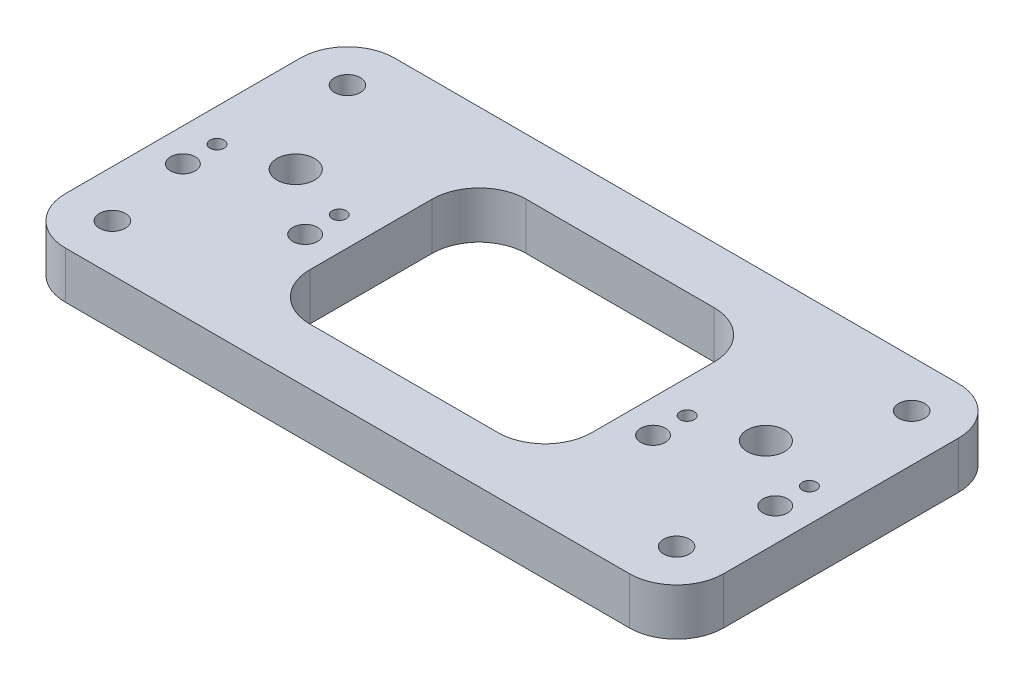
ISO-10303-21;
HEADER;
FILE_DESCRIPTION(('STEP AP214'),'2;1');
FILE_NAME('part.step','',(''),(''),'','','');
FILE_SCHEMA(('AUTOMOTIVE_DESIGN { 1 0 10303 214 1 1 1 1 }'));
ENDSEC;
DATA;
#1=APPLICATION_CONTEXT('core data for automotive mechanical design processes');
#2=APPLICATION_PROTOCOL_DEFINITION('international standard','automotive_design',2000,#1);
#3=PRODUCT_CONTEXT('',#1,'mechanical');
#4=PRODUCT('Part','Part','',(#3));
#5=PRODUCT_RELATED_PRODUCT_CATEGORY('part','',(#4));
#6=PRODUCT_DEFINITION_FORMATION('','',#4);
#7=PRODUCT_DEFINITION_CONTEXT('part definition',#1,'design');
#8=PRODUCT_DEFINITION('design','',#6,#7);
#9=PRODUCT_DEFINITION_SHAPE('','',#8);
#10=(LENGTH_UNIT() NAMED_UNIT(*) SI_UNIT(.MILLI.,.METRE.));
#11=(NAMED_UNIT(*) PLANE_ANGLE_UNIT() SI_UNIT($,.RADIAN.));
#12=(NAMED_UNIT(*) SI_UNIT($,.STERADIAN.) SOLID_ANGLE_UNIT());
#13=UNCERTAINTY_MEASURE_WITH_UNIT(LENGTH_MEASURE(1.E-05),#10,'distance_accuracy_value','');
#14=(GEOMETRIC_REPRESENTATION_CONTEXT(3) GLOBAL_UNCERTAINTY_ASSIGNED_CONTEXT((#13)) GLOBAL_UNIT_ASSIGNED_CONTEXT((#10,
#11,#12)) REPRESENTATION_CONTEXT('',''));
#15=CARTESIAN_POINT('',(0.,0.,0.));
#16=DIRECTION('',(0.,0.,1.));
#17=DIRECTION('',(1.,0.,0.));
#18=AXIS2_PLACEMENT_3D('',#15,#16,#17);
#19=CARTESIAN_POINT('',(70.,10.,-35.));
#20=DIRECTION('',(-1.,0.,0.));
#21=DIRECTION('',(0.,0.,1.));
#22=AXIS2_PLACEMENT_3D('',#19,#20,#21);
#23=PLANE('',#22);
#24=DIRECTION('',(0.,0.,-1.));
#25=VECTOR('',#24,1.);
#26=CARTESIAN_POINT('',(70.,10.,-35.));
#27=LINE('',#26,#25);
#28=CARTESIAN_POINT('',(70.,10.,25.));
#29=VERTEX_POINT('',#28);
#30=CARTESIAN_POINT('',(70.,10.,-25.));
#31=VERTEX_POINT('',#30);
#32=EDGE_CURVE('E168',#29,#31,#27,.T.);
#33=ORIENTED_EDGE('',*,*,#32,.F.);
#34=DIRECTION('',(0.,-1.,0.));
#35=VECTOR('',#34,1.);
#36=CARTESIAN_POINT('',(70.,10.,25.));
#37=LINE('',#36,#35);
#38=CARTESIAN_POINT('',(70.,0.,25.));
#39=VERTEX_POINT('',#38);
#40=EDGE_CURVE('E153',#29,#39,#37,.T.);
#41=ORIENTED_EDGE('',*,*,#40,.T.);
#42=DIRECTION('',(0.,0.,-1.));
#43=VECTOR('',#42,1.);
#44=CARTESIAN_POINT('',(70.,0.,-35.));
#45=LINE('',#44,#43);
#46=CARTESIAN_POINT('',(70.,0.,-25.));
#47=VERTEX_POINT('',#46);
#48=EDGE_CURVE('E165',#39,#47,#45,.T.);
#49=ORIENTED_EDGE('',*,*,#48,.T.);
#50=DIRECTION('',(0.,-1.,0.));
#51=VECTOR('',#50,1.);
#52=CARTESIAN_POINT('',(70.,10.,-25.));
#53=LINE('',#52,#51);
#54=EDGE_CURVE('E170',#47,#31,#53,.F.);
#55=ORIENTED_EDGE('',*,*,#54,.T.);
#56=EDGE_LOOP('',(#33,#41,#49,#55));
#57=FACE_BOUND('',#56,.T.);
#58=ADVANCED_FACE('F35',(#57),#23,.F.);
#59=CARTESIAN_POINT('',(-70.,10.,-35.));
#60=DIRECTION('',(0.,0.,1.));
#61=DIRECTION('',(1.,0.,0.));
#62=AXIS2_PLACEMENT_3D('',#59,#60,#61);
#63=PLANE('',#62);
#64=DIRECTION('',(-1.,0.,0.));
#65=VECTOR('',#64,1.);
#66=CARTESIAN_POINT('',(-70.,10.,-35.));
#67=LINE('',#66,#65);
#68=CARTESIAN_POINT('',(60.,10.,-35.));
#69=VERTEX_POINT('',#68);
#70=CARTESIAN_POINT('',(-60.,10.,-35.));
#71=VERTEX_POINT('',#70);
#72=EDGE_CURVE('E365',#69,#71,#67,.T.);
#73=ORIENTED_EDGE('',*,*,#72,.F.);
#74=DIRECTION('',(0.,-1.,0.));
#75=VECTOR('',#74,1.);
#76=CARTESIAN_POINT('',(60.,10.,-35.));
#77=LINE('',#76,#75);
#78=CARTESIAN_POINT('',(60.,0.,-35.));
#79=VERTEX_POINT('',#78);
#80=EDGE_CURVE('E209',#69,#79,#77,.T.);
#81=ORIENTED_EDGE('',*,*,#80,.T.);
#82=DIRECTION('',(-1.,0.,0.));
#83=VECTOR('',#82,1.);
#84=CARTESIAN_POINT('',(-70.,0.,-35.));
#85=LINE('',#84,#83);
#86=CARTESIAN_POINT('',(-60.,0.,-35.));
#87=VERTEX_POINT('',#86);
#88=EDGE_CURVE('E174',#79,#87,#85,.T.);
#89=ORIENTED_EDGE('',*,*,#88,.T.);
#90=DIRECTION('',(0.,-1.,0.));
#91=VECTOR('',#90,1.);
#92=CARTESIAN_POINT('',(-60.,10.,-35.));
#93=LINE('',#92,#91);
#94=EDGE_CURVE('E207',#87,#71,#93,.F.);
#95=ORIENTED_EDGE('',*,*,#94,.T.);
#96=EDGE_LOOP('',(#73,#81,#89,#95));
#97=FACE_BOUND('',#96,.T.);
#98=ADVANCED_FACE('F390',(#97),#63,.F.);
#99=CARTESIAN_POINT('',(-70.,10.,-35.));
#100=DIRECTION('',(1.,0.,0.));
#101=DIRECTION('',(0.,0.,-1.));
#102=AXIS2_PLACEMENT_3D('',#99,#100,#101);
#103=PLANE('',#102);
#104=DIRECTION('',(0.,0.,1.));
#105=VECTOR('',#104,1.);
#106=CARTESIAN_POINT('',(-70.,10.,-35.));
#107=LINE('',#106,#105);
#108=CARTESIAN_POINT('',(-70.,10.,-25.));
#109=VERTEX_POINT('',#108);
#110=CARTESIAN_POINT('',(-70.,10.,25.));
#111=VERTEX_POINT('',#110);
#112=EDGE_CURVE('E367',#109,#111,#107,.T.);
#113=ORIENTED_EDGE('',*,*,#112,.F.);
#114=DIRECTION('',(0.,-1.,0.));
#115=VECTOR('',#114,1.);
#116=CARTESIAN_POINT('',(-70.,10.,-25.));
#117=LINE('',#116,#115);
#118=CARTESIAN_POINT('',(-70.,0.,-25.));
#119=VERTEX_POINT('',#118);
#120=EDGE_CURVE('E214',#109,#119,#117,.T.);
#121=ORIENTED_EDGE('',*,*,#120,.T.);
#122=DIRECTION('',(0.,0.,1.));
#123=VECTOR('',#122,1.);
#124=CARTESIAN_POINT('',(-70.,0.,-35.));
#125=LINE('',#124,#123);
#126=CARTESIAN_POINT('',(-70.,0.,25.));
#127=VERTEX_POINT('',#126);
#128=EDGE_CURVE('E178',#119,#127,#125,.T.);
#129=ORIENTED_EDGE('',*,*,#128,.T.);
#130=DIRECTION('',(0.,-1.,0.));
#131=VECTOR('',#130,1.);
#132=CARTESIAN_POINT('',(-70.,10.,25.));
#133=LINE('',#132,#131);
#134=EDGE_CURVE('E212',#127,#111,#133,.F.);
#135=ORIENTED_EDGE('',*,*,#134,.T.);
#136=EDGE_LOOP('',(#113,#121,#129,#135));
#137=FACE_BOUND('',#136,.T.);
#138=ADVANCED_FACE('F382',(#137),#103,.F.);
#139=CARTESIAN_POINT('',(-70.,10.,35.));
#140=DIRECTION('',(0.,0.,-1.));
#141=DIRECTION('',(-1.,0.,0.));
#142=AXIS2_PLACEMENT_3D('',#139,#140,#141);
#143=PLANE('',#142);
#144=DIRECTION('',(1.,0.,0.));
#145=VECTOR('',#144,1.);
#146=CARTESIAN_POINT('',(-70.,0.,35.));
#147=LINE('',#146,#145);
#148=CARTESIAN_POINT('',(-60.,0.,35.));
#149=VERTEX_POINT('',#148);
#150=CARTESIAN_POINT('',(60.,0.,35.));
#151=VERTEX_POINT('',#150);
#152=EDGE_CURVE('E189',#149,#151,#147,.T.);
#153=ORIENTED_EDGE('',*,*,#152,.T.);
#154=DIRECTION('',(0.,-1.,0.));
#155=VECTOR('',#154,1.);
#156=CARTESIAN_POINT('',(60.,10.,35.));
#157=LINE('',#156,#155);
#158=CARTESIAN_POINT('',(60.,10.,35.));
#159=VERTEX_POINT('',#158);
#160=EDGE_CURVE('E154',#151,#159,#157,.F.);
#161=ORIENTED_EDGE('',*,*,#160,.T.);
#162=DIRECTION('',(1.,0.,0.));
#163=VECTOR('',#162,1.);
#164=CARTESIAN_POINT('',(-70.,10.,35.));
#165=LINE('',#164,#163);
#166=CARTESIAN_POINT('',(-60.,10.,35.));
#167=VERTEX_POINT('',#166);
#168=EDGE_CURVE('E184',#167,#159,#165,.T.);
#169=ORIENTED_EDGE('',*,*,#168,.F.);
#170=DIRECTION('',(0.,-1.,0.));
#171=VECTOR('',#170,1.);
#172=CARTESIAN_POINT('',(-60.,10.,35.));
#173=LINE('',#172,#171);
#174=EDGE_CURVE('E159',#167,#149,#173,.T.);
#175=ORIENTED_EDGE('',*,*,#174,.T.);
#176=EDGE_LOOP('',(#153,#161,#169,#175));
#177=FACE_BOUND('',#176,.T.);
#178=ADVANCED_FACE('F376',(#177),#143,.F.);
#179=CARTESIAN_POINT('',(70.,10.,35.));
#180=DIRECTION('',(0.,1.,0.));
#181=DIRECTION('',(0.,0.,1.));
#182=AXIS2_PLACEMENT_3D('',#179,#180,#181);
#183=PLANE('',#182);
#184=DIRECTION('',(0.,0.,1.));
#185=VECTOR('',#184,1.);
#186=CARTESIAN_POINT('',(-30.,10.,-23.));
#187=LINE('',#186,#185);
#188=CARTESIAN_POINT('',(-30.,10.,-13.));
#189=VERTEX_POINT('',#188);
#190=CARTESIAN_POINT('',(-30.,10.,13.));
#191=VERTEX_POINT('',#190);
#192=EDGE_CURVE('E251',#189,#191,#187,.T.);
#193=ORIENTED_EDGE('',*,*,#192,.F.);
#194=CARTESIAN_POINT('',(-20.,10.,-13.));
#195=DIRECTION('',(0.,1.,0.));
#196=DIRECTION('',(0.,0.,1.));
#197=AXIS2_PLACEMENT_3D('',#194,#195,#196);
#198=CIRCLE('',#197,10.);
#199=CARTESIAN_POINT('',(-20.,10.,-23.));
#200=VERTEX_POINT('',#199);
#201=EDGE_CURVE('E244',#189,#200,#198,.F.);
#202=ORIENTED_EDGE('',*,*,#201,.T.);
#203=DIRECTION('',(-1.,0.,0.));
#204=VECTOR('',#203,1.);
#205=CARTESIAN_POINT('',(30.,10.,-23.));
#206=LINE('',#205,#204);
#207=CARTESIAN_POINT('',(20.,10.,-23.));
#208=VERTEX_POINT('',#207);
#209=EDGE_CURVE('E274',#208,#200,#206,.T.);
#210=ORIENTED_EDGE('',*,*,#209,.F.);
#211=CARTESIAN_POINT('',(20.,10.,-13.));
#212=DIRECTION('',(0.,1.,0.));
#213=DIRECTION('',(0.,0.,1.));
#214=AXIS2_PLACEMENT_3D('',#211,#212,#213);
#215=CIRCLE('',#214,10.);
#216=CARTESIAN_POINT('',(30.,10.,-13.));
#217=VERTEX_POINT('',#216);
#218=EDGE_CURVE('E236',#208,#217,#215,.F.);
#219=ORIENTED_EDGE('',*,*,#218,.T.);
#220=DIRECTION('',(0.,0.,-1.));
#221=VECTOR('',#220,1.);
#222=CARTESIAN_POINT('',(30.,10.,-23.));
#223=LINE('',#222,#221);
#224=CARTESIAN_POINT('',(30.,10.,13.));
#225=VERTEX_POINT('',#224);
#226=EDGE_CURVE('E280',#225,#217,#223,.T.);
#227=ORIENTED_EDGE('',*,*,#226,.F.);
#228=CARTESIAN_POINT('',(20.,10.,13.));
#229=DIRECTION('',(0.,1.,0.));
#230=DIRECTION('',(0.,0.,1.));
#231=AXIS2_PLACEMENT_3D('',#228,#229,#230);
#232=CIRCLE('',#231,10.);
#233=CARTESIAN_POINT('',(20.,10.,23.));
#234=VERTEX_POINT('',#233);
#235=EDGE_CURVE('E240',#225,#234,#232,.F.);
#236=ORIENTED_EDGE('',*,*,#235,.T.);
#237=DIRECTION('',(1.,0.,0.));
#238=VECTOR('',#237,1.);
#239=CARTESIAN_POINT('',(30.,10.,23.));
#240=LINE('',#239,#238);
#241=CARTESIAN_POINT('',(-20.,10.,23.));
#242=VERTEX_POINT('',#241);
#243=EDGE_CURVE('E253',#242,#234,#240,.T.);
#244=ORIENTED_EDGE('',*,*,#243,.F.);
#245=CARTESIAN_POINT('',(-20.,10.,13.));
#246=DIRECTION('',(0.,1.,0.));
#247=DIRECTION('',(0.,0.,1.));
#248=AXIS2_PLACEMENT_3D('',#245,#246,#247);
#249=CIRCLE('',#248,10.);
#250=EDGE_CURVE('E43',#242,#191,#249,.F.);
#251=ORIENTED_EDGE('',*,*,#250,.T.);
#252=EDGE_LOOP('',(#193,#202,#210,#219,#227,#236,#244,#251));
#253=FACE_BOUND('',#252,.T.);
#254=CARTESIAN_POINT('',(63.,10.,-0.250000000000004));
#255=DIRECTION('',(0.,1.,0.));
#256=DIRECTION('',(0.,0.,1.));
#257=AXIS2_PLACEMENT_3D('',#254,#255,#256);
#258=CIRCLE('',#257,1.5);
#259=CARTESIAN_POINT('',(63.,10.,1.24999999999999));
#260=VERTEX_POINT('',#259);
#261=EDGE_CURVE('E277',#260,#260,#258,.T.);
#262=ORIENTED_EDGE('',*,*,#261,.F.);
#263=EDGE_LOOP('',(#262));
#264=FACE_BOUND('',#263,.T.);
#265=CARTESIAN_POINT('',(37.,10.,-0.250000000000004));
#266=DIRECTION('',(0.,1.,0.));
#267=DIRECTION('',(0.,0.,1.));
#268=AXIS2_PLACEMENT_3D('',#265,#266,#267);
#269=CIRCLE('',#268,1.5);
#270=CARTESIAN_POINT('',(37.,10.,1.25));
#271=VERTEX_POINT('',#270);
#272=EDGE_CURVE('E288',#271,#271,#269,.T.);
#273=ORIENTED_EDGE('',*,*,#272,.F.);
#274=EDGE_LOOP('',(#273));
#275=FACE_BOUND('',#274,.T.);
#276=CARTESIAN_POINT('',(-37.,10.,-0.250000000000004));
#277=DIRECTION('',(0.,1.,0.));
#278=DIRECTION('',(0.,0.,1.));
#279=AXIS2_PLACEMENT_3D('',#276,#277,#278);
#280=CIRCLE('',#279,1.5);
#281=CARTESIAN_POINT('',(-37.,10.,1.25));
#282=VERTEX_POINT('',#281);
#283=EDGE_CURVE('E294',#282,#282,#280,.T.);
#284=ORIENTED_EDGE('',*,*,#283,.F.);
#285=EDGE_LOOP('',(#284));
#286=FACE_BOUND('',#285,.T.);
#287=CARTESIAN_POINT('',(-63.,10.,-0.250000000000004));
#288=DIRECTION('',(0.,1.,0.));
#289=DIRECTION('',(0.,0.,1.));
#290=AXIS2_PLACEMENT_3D('',#287,#288,#289);
#291=CIRCLE('',#290,1.5);
#292=CARTESIAN_POINT('',(-63.,10.,1.25));
#293=VERTEX_POINT('',#292);
#294=EDGE_CURVE('E300',#293,#293,#291,.T.);
#295=ORIENTED_EDGE('',*,*,#294,.F.);
#296=EDGE_LOOP('',(#295));
#297=FACE_BOUND('',#296,.T.);
#298=CARTESIAN_POINT('',(63.,10.,6.99999999999999));
#299=DIRECTION('',(0.,1.,0.));
#300=DIRECTION('',(0.,0.,1.));
#301=AXIS2_PLACEMENT_3D('',#298,#299,#300);
#302=CIRCLE('',#301,2.625);
#303=CARTESIAN_POINT('',(63.,10.,9.625));
#304=VERTEX_POINT('',#303);
#305=EDGE_CURVE('E306',#304,#304,#302,.T.);
#306=ORIENTED_EDGE('',*,*,#305,.F.);
#307=EDGE_LOOP('',(#306));
#308=FACE_BOUND('',#307,.T.);
#309=CARTESIAN_POINT('',(37.,10.,7.));
#310=DIRECTION('',(0.,1.,0.));
#311=DIRECTION('',(0.,0.,1.));
#312=AXIS2_PLACEMENT_3D('',#309,#310,#311);
#313=CIRCLE('',#312,2.625);
#314=CARTESIAN_POINT('',(37.,10.,9.625));
#315=VERTEX_POINT('',#314);
#316=EDGE_CURVE('E312',#315,#315,#313,.T.);
#317=ORIENTED_EDGE('',*,*,#316,.F.);
#318=EDGE_LOOP('',(#317));
#319=FACE_BOUND('',#318,.T.);
#320=CARTESIAN_POINT('',(-37.,10.,6.99999999999999));
#321=DIRECTION('',(0.,1.,0.));
#322=DIRECTION('',(0.,0.,1.));
#323=AXIS2_PLACEMENT_3D('',#320,#321,#322);
#324=CIRCLE('',#323,2.625);
#325=CARTESIAN_POINT('',(-37.,10.,9.625));
#326=VERTEX_POINT('',#325);
#327=EDGE_CURVE('E318',#326,#326,#324,.T.);
#328=ORIENTED_EDGE('',*,*,#327,.F.);
#329=EDGE_LOOP('',(#328));
#330=FACE_BOUND('',#329,.T.);
#331=CARTESIAN_POINT('',(-63.,10.,7.));
#332=DIRECTION('',(0.,1.,0.));
#333=DIRECTION('',(0.,0.,1.));
#334=AXIS2_PLACEMENT_3D('',#331,#332,#333);
#335=CIRCLE('',#334,2.625);
#336=CARTESIAN_POINT('',(-63.,10.,9.625));
#337=VERTEX_POINT('',#336);
#338=EDGE_CURVE('E324',#337,#337,#335,.T.);
#339=ORIENTED_EDGE('',*,*,#338,.F.);
#340=EDGE_LOOP('',(#339));
#341=FACE_BOUND('',#340,.T.);
#342=CARTESIAN_POINT('',(50.,10.,-4.));
#343=DIRECTION('',(0.,1.,0.));
#344=DIRECTION('',(0.,0.,-1.));
#345=AXIS2_PLACEMENT_3D('',#342,#343,#344);
#346=CIRCLE('',#345,4.00000000000001);
#347=CARTESIAN_POINT('',(50.,10.,-8.00000000000001));
#348=VERTEX_POINT('',#347);
#349=EDGE_CURVE('E330',#348,#348,#346,.T.);
#350=ORIENTED_EDGE('',*,*,#349,.F.);
#351=EDGE_LOOP('',(#350));
#352=FACE_BOUND('',#351,.T.);
#353=CARTESIAN_POINT('',(-50.,10.,-4.));
#354=DIRECTION('',(0.,1.,0.));
#355=DIRECTION('',(0.,0.,1.));
#356=AXIS2_PLACEMENT_3D('',#353,#354,#355);
#357=CIRCLE('',#356,4.00000000000001);
#358=CARTESIAN_POINT('',(-50.,10.,0.));
#359=VERTEX_POINT('',#358);
#360=EDGE_CURVE('E336',#359,#359,#357,.T.);
#361=ORIENTED_EDGE('',*,*,#360,.F.);
#362=EDGE_LOOP('',(#361));
#363=FACE_BOUND('',#362,.T.);
#364=CARTESIAN_POINT('',(60.,10.,-25.));
#365=DIRECTION('',(0.,1.,0.));
#366=DIRECTION('',(0.,0.,1.));
#367=AXIS2_PLACEMENT_3D('',#364,#365,#366);
#368=CIRCLE('',#367,2.75);
#369=CARTESIAN_POINT('',(60.,10.,-22.25));
#370=VERTEX_POINT('',#369);
#371=EDGE_CURVE('E342',#370,#370,#368,.T.);
#372=ORIENTED_EDGE('',*,*,#371,.F.);
#373=EDGE_LOOP('',(#372));
#374=FACE_BOUND('',#373,.T.);
#375=CARTESIAN_POINT('',(60.,10.,25.));
#376=DIRECTION('',(0.,1.,0.));
#377=DIRECTION('',(0.,0.,-1.));
#378=AXIS2_PLACEMENT_3D('',#375,#376,#377);
#379=CIRCLE('',#378,2.75);
#380=CARTESIAN_POINT('',(60.,10.,22.25));
#381=VERTEX_POINT('',#380);
#382=EDGE_CURVE('E348',#381,#381,#379,.T.);
#383=ORIENTED_EDGE('',*,*,#382,.F.);
#384=EDGE_LOOP('',(#383));
#385=FACE_BOUND('',#384,.T.);
#386=CARTESIAN_POINT('',(-60.,10.,-25.));
#387=DIRECTION('',(0.,1.,0.));
#388=DIRECTION('',(0.,0.,-1.));
#389=AXIS2_PLACEMENT_3D('',#386,#387,#388);
#390=CIRCLE('',#389,2.75);
#391=CARTESIAN_POINT('',(-60.,10.,-27.75));
#392=VERTEX_POINT('',#391);
#393=EDGE_CURVE('E354',#392,#392,#390,.T.);
#394=ORIENTED_EDGE('',*,*,#393,.F.);
#395=EDGE_LOOP('',(#394));
#396=FACE_BOUND('',#395,.T.);
#397=CARTESIAN_POINT('',(-60.,10.,25.));
#398=DIRECTION('',(0.,1.,0.));
#399=DIRECTION('',(0.,0.,1.));
#400=AXIS2_PLACEMENT_3D('',#397,#398,#399);
#401=CIRCLE('',#400,2.75);
#402=CARTESIAN_POINT('',(-60.,10.,27.75));
#403=VERTEX_POINT('',#402);
#404=EDGE_CURVE('E181',#403,#403,#401,.T.);
#405=ORIENTED_EDGE('',*,*,#404,.F.);
#406=EDGE_LOOP('',(#405));
#407=FACE_BOUND('',#406,.T.);
#408=ORIENTED_EDGE('',*,*,#168,.T.);
#409=CARTESIAN_POINT('',(60.,10.,25.));
#410=DIRECTION('',(0.,1.,0.));
#411=DIRECTION('',(0.,0.,1.));
#412=AXIS2_PLACEMENT_3D('',#409,#410,#411);
#413=CIRCLE('',#412,10.);
#414=EDGE_CURVE('E205',#159,#29,#413,.T.);
#415=ORIENTED_EDGE('',*,*,#414,.T.);
#416=ORIENTED_EDGE('',*,*,#32,.T.);
#417=CARTESIAN_POINT('',(60.,10.,-25.));
#418=DIRECTION('',(0.,1.,0.));
#419=DIRECTION('',(0.,0.,1.));
#420=AXIS2_PLACEMENT_3D('',#417,#418,#419);
#421=CIRCLE('',#420,10.);
#422=EDGE_CURVE('E203',#31,#69,#421,.T.);
#423=ORIENTED_EDGE('',*,*,#422,.T.);
#424=ORIENTED_EDGE('',*,*,#72,.T.);
#425=CARTESIAN_POINT('',(-60.,10.,-25.));
#426=DIRECTION('',(0.,1.,0.));
#427=DIRECTION('',(0.,0.,1.));
#428=AXIS2_PLACEMENT_3D('',#425,#426,#427);
#429=CIRCLE('',#428,10.);
#430=EDGE_CURVE('E201',#71,#109,#429,.T.);
#431=ORIENTED_EDGE('',*,*,#430,.T.);
#432=ORIENTED_EDGE('',*,*,#112,.T.);
#433=CARTESIAN_POINT('',(-60.,10.,25.));
#434=DIRECTION('',(0.,1.,0.));
#435=DIRECTION('',(0.,0.,1.));
#436=AXIS2_PLACEMENT_3D('',#433,#434,#435);
#437=CIRCLE('',#436,10.);
#438=EDGE_CURVE('E199',#111,#167,#437,.T.);
#439=ORIENTED_EDGE('',*,*,#438,.T.);
#440=EDGE_LOOP('',(#408,#415,#416,#423,#424,#431,#432,#439));
#441=FACE_BOUND('',#440,.T.);
#442=ADVANCED_FACE('F249',(#253,#264,#275,#286,#297,#308,#319,#330,#341,#352,#363,#374,#385,
#396,#407,#441),#183,.T.);
#443=CARTESIAN_POINT('',(70.,0.,35.));
#444=DIRECTION('',(0.,1.,0.));
#445=DIRECTION('',(0.,0.,1.));
#446=AXIS2_PLACEMENT_3D('',#443,#444,#445);
#447=PLANE('',#446);
#448=DIRECTION('',(0.,0.,-1.));
#449=VECTOR('',#448,1.);
#450=CARTESIAN_POINT('',(30.,0.,-23.));
#451=LINE('',#450,#449);
#452=CARTESIAN_POINT('',(30.,0.,13.));
#453=VERTEX_POINT('',#452);
#454=CARTESIAN_POINT('',(30.,0.,-13.));
#455=VERTEX_POINT('',#454);
#456=EDGE_CURVE('E270',#453,#455,#451,.T.);
#457=ORIENTED_EDGE('',*,*,#456,.T.);
#458=CARTESIAN_POINT('',(20.,0.,-13.));
#459=DIRECTION('',(0.,1.,0.));
#460=DIRECTION('',(0.,0.,1.));
#461=AXIS2_PLACEMENT_3D('',#458,#459,#460);
#462=CIRCLE('',#461,10.);
#463=CARTESIAN_POINT('',(20.,0.,-23.));
#464=VERTEX_POINT('',#463);
#465=EDGE_CURVE('E238',#455,#464,#462,.T.);
#466=ORIENTED_EDGE('',*,*,#465,.T.);
#467=DIRECTION('',(-1.,0.,0.));
#468=VECTOR('',#467,1.);
#469=CARTESIAN_POINT('',(30.,0.,-23.));
#470=LINE('',#469,#468);
#471=CARTESIAN_POINT('',(-20.,0.,-23.));
#472=VERTEX_POINT('',#471);
#473=EDGE_CURVE('E272',#464,#472,#470,.T.);
#474=ORIENTED_EDGE('',*,*,#473,.T.);
#475=CARTESIAN_POINT('',(-20.,0.,-13.));
#476=DIRECTION('',(0.,1.,0.));
#477=DIRECTION('',(0.,0.,1.));
#478=AXIS2_PLACEMENT_3D('',#475,#476,#477);
#479=CIRCLE('',#478,10.);
#480=CARTESIAN_POINT('',(-30.,0.,-13.));
#481=VERTEX_POINT('',#480);
#482=EDGE_CURVE('E57',#472,#481,#479,.T.);
#483=ORIENTED_EDGE('',*,*,#482,.T.);
#484=DIRECTION('',(0.,0.,1.));
#485=VECTOR('',#484,1.);
#486=CARTESIAN_POINT('',(-30.,0.,-23.));
#487=LINE('',#486,#485);
#488=CARTESIAN_POINT('',(-30.,0.,13.));
#489=VERTEX_POINT('',#488);
#490=EDGE_CURVE('E266',#481,#489,#487,.T.);
#491=ORIENTED_EDGE('',*,*,#490,.T.);
#492=CARTESIAN_POINT('',(-20.,0.,13.));
#493=DIRECTION('',(0.,1.,0.));
#494=DIRECTION('',(0.,0.,1.));
#495=AXIS2_PLACEMENT_3D('',#492,#493,#494);
#496=CIRCLE('',#495,10.);
#497=CARTESIAN_POINT('',(-20.,0.,23.));
#498=VERTEX_POINT('',#497);
#499=EDGE_CURVE('E11',#489,#498,#496,.T.);
#500=ORIENTED_EDGE('',*,*,#499,.T.);
#501=DIRECTION('',(1.,0.,0.));
#502=VECTOR('',#501,1.);
#503=CARTESIAN_POINT('',(30.,0.,23.));
#504=LINE('',#503,#502);
#505=CARTESIAN_POINT('',(20.,0.,23.));
#506=VERTEX_POINT('',#505);
#507=EDGE_CURVE('E264',#498,#506,#504,.T.);
#508=ORIENTED_EDGE('',*,*,#507,.T.);
#509=CARTESIAN_POINT('',(20.,0.,13.));
#510=DIRECTION('',(0.,1.,0.));
#511=DIRECTION('',(0.,0.,1.));
#512=AXIS2_PLACEMENT_3D('',#509,#510,#511);
#513=CIRCLE('',#512,10.);
#514=EDGE_CURVE('E242',#506,#453,#513,.T.);
#515=ORIENTED_EDGE('',*,*,#514,.T.);
#516=EDGE_LOOP('',(#457,#466,#474,#483,#491,#500,#508,#515));
#517=FACE_BOUND('',#516,.T.);
#518=CARTESIAN_POINT('',(63.,0.,-0.250000000000004));
#519=DIRECTION('',(0.,1.,0.));
#520=DIRECTION('',(0.,0.,1.));
#521=AXIS2_PLACEMENT_3D('',#518,#519,#520);
#522=CIRCLE('',#521,1.5);
#523=CARTESIAN_POINT('',(63.,0.,1.24999999999999));
#524=VERTEX_POINT('',#523);
#525=EDGE_CURVE('E285',#524,#524,#522,.T.);
#526=ORIENTED_EDGE('',*,*,#525,.T.);
#527=EDGE_LOOP('',(#526));
#528=FACE_BOUND('',#527,.T.);
#529=CARTESIAN_POINT('',(37.,0.,-0.250000000000004));
#530=DIRECTION('',(0.,1.,0.));
#531=DIRECTION('',(0.,0.,1.));
#532=AXIS2_PLACEMENT_3D('',#529,#530,#531);
#533=CIRCLE('',#532,1.5);
#534=CARTESIAN_POINT('',(37.,0.,1.25));
#535=VERTEX_POINT('',#534);
#536=EDGE_CURVE('E291',#535,#535,#533,.T.);
#537=ORIENTED_EDGE('',*,*,#536,.T.);
#538=EDGE_LOOP('',(#537));
#539=FACE_BOUND('',#538,.T.);
#540=CARTESIAN_POINT('',(-37.,0.,-0.250000000000004));
#541=DIRECTION('',(0.,1.,0.));
#542=DIRECTION('',(0.,0.,1.));
#543=AXIS2_PLACEMENT_3D('',#540,#541,#542);
#544=CIRCLE('',#543,1.5);
#545=CARTESIAN_POINT('',(-37.,0.,1.25));
#546=VERTEX_POINT('',#545);
#547=EDGE_CURVE('E297',#546,#546,#544,.T.);
#548=ORIENTED_EDGE('',*,*,#547,.T.);
#549=EDGE_LOOP('',(#548));
#550=FACE_BOUND('',#549,.T.);
#551=CARTESIAN_POINT('',(-63.,0.,-0.250000000000004));
#552=DIRECTION('',(0.,1.,0.));
#553=DIRECTION('',(0.,0.,1.));
#554=AXIS2_PLACEMENT_3D('',#551,#552,#553);
#555=CIRCLE('',#554,1.5);
#556=CARTESIAN_POINT('',(-63.,0.,1.25));
#557=VERTEX_POINT('',#556);
#558=EDGE_CURVE('E303',#557,#557,#555,.T.);
#559=ORIENTED_EDGE('',*,*,#558,.T.);
#560=EDGE_LOOP('',(#559));
#561=FACE_BOUND('',#560,.T.);
#562=CARTESIAN_POINT('',(63.,0.,6.99999999999999));
#563=DIRECTION('',(0.,1.,0.));
#564=DIRECTION('',(0.,0.,1.));
#565=AXIS2_PLACEMENT_3D('',#562,#563,#564);
#566=CIRCLE('',#565,2.625);
#567=CARTESIAN_POINT('',(63.,0.,9.625));
#568=VERTEX_POINT('',#567);
#569=EDGE_CURVE('E309',#568,#568,#566,.T.);
#570=ORIENTED_EDGE('',*,*,#569,.T.);
#571=EDGE_LOOP('',(#570));
#572=FACE_BOUND('',#571,.T.);
#573=CARTESIAN_POINT('',(37.,0.,7.));
#574=DIRECTION('',(0.,1.,0.));
#575=DIRECTION('',(0.,0.,1.));
#576=AXIS2_PLACEMENT_3D('',#573,#574,#575);
#577=CIRCLE('',#576,2.625);
#578=CARTESIAN_POINT('',(37.,0.,9.625));
#579=VERTEX_POINT('',#578);
#580=EDGE_CURVE('E315',#579,#579,#577,.T.);
#581=ORIENTED_EDGE('',*,*,#580,.T.);
#582=EDGE_LOOP('',(#581));
#583=FACE_BOUND('',#582,.T.);
#584=CARTESIAN_POINT('',(-37.,0.,6.99999999999999));
#585=DIRECTION('',(0.,1.,0.));
#586=DIRECTION('',(0.,0.,1.));
#587=AXIS2_PLACEMENT_3D('',#584,#585,#586);
#588=CIRCLE('',#587,2.625);
#589=CARTESIAN_POINT('',(-37.,0.,9.625));
#590=VERTEX_POINT('',#589);
#591=EDGE_CURVE('E321',#590,#590,#588,.T.);
#592=ORIENTED_EDGE('',*,*,#591,.T.);
#593=EDGE_LOOP('',(#592));
#594=FACE_BOUND('',#593,.T.);
#595=CARTESIAN_POINT('',(-63.,0.,7.));
#596=DIRECTION('',(0.,1.,0.));
#597=DIRECTION('',(0.,0.,1.));
#598=AXIS2_PLACEMENT_3D('',#595,#596,#597);
#599=CIRCLE('',#598,2.625);
#600=CARTESIAN_POINT('',(-63.,0.,9.625));
#601=VERTEX_POINT('',#600);
#602=EDGE_CURVE('E327',#601,#601,#599,.T.);
#603=ORIENTED_EDGE('',*,*,#602,.T.);
#604=EDGE_LOOP('',(#603));
#605=FACE_BOUND('',#604,.T.);
#606=CARTESIAN_POINT('',(50.,0.,-4.));
#607=DIRECTION('',(0.,1.,0.));
#608=DIRECTION('',(0.,0.,-1.));
#609=AXIS2_PLACEMENT_3D('',#606,#607,#608);
#610=CIRCLE('',#609,4.00000000000001);
#611=CARTESIAN_POINT('',(50.,0.,-8.00000000000001));
#612=VERTEX_POINT('',#611);
#613=EDGE_CURVE('E333',#612,#612,#610,.T.);
#614=ORIENTED_EDGE('',*,*,#613,.T.);
#615=EDGE_LOOP('',(#614));
#616=FACE_BOUND('',#615,.T.);
#617=CARTESIAN_POINT('',(-50.,0.,-4.));
#618=DIRECTION('',(0.,1.,0.));
#619=DIRECTION('',(0.,0.,1.));
#620=AXIS2_PLACEMENT_3D('',#617,#618,#619);
#621=CIRCLE('',#620,4.00000000000001);
#622=CARTESIAN_POINT('',(-50.,0.,0.));
#623=VERTEX_POINT('',#622);
#624=EDGE_CURVE('E339',#623,#623,#621,.T.);
#625=ORIENTED_EDGE('',*,*,#624,.T.);
#626=EDGE_LOOP('',(#625));
#627=FACE_BOUND('',#626,.T.);
#628=CARTESIAN_POINT('',(60.,0.,-25.));
#629=DIRECTION('',(0.,1.,0.));
#630=DIRECTION('',(0.,0.,1.));
#631=AXIS2_PLACEMENT_3D('',#628,#629,#630);
#632=CIRCLE('',#631,2.75);
#633=CARTESIAN_POINT('',(60.,0.,-22.25));
#634=VERTEX_POINT('',#633);
#635=EDGE_CURVE('E345',#634,#634,#632,.T.);
#636=ORIENTED_EDGE('',*,*,#635,.T.);
#637=EDGE_LOOP('',(#636));
#638=FACE_BOUND('',#637,.T.);
#639=CARTESIAN_POINT('',(60.,0.,25.));
#640=DIRECTION('',(0.,1.,0.));
#641=DIRECTION('',(0.,0.,-1.));
#642=AXIS2_PLACEMENT_3D('',#639,#640,#641);
#643=CIRCLE('',#642,2.75);
#644=CARTESIAN_POINT('',(60.,0.,22.25));
#645=VERTEX_POINT('',#644);
#646=EDGE_CURVE('E351',#645,#645,#643,.T.);
#647=ORIENTED_EDGE('',*,*,#646,.T.);
#648=EDGE_LOOP('',(#647));
#649=FACE_BOUND('',#648,.T.);
#650=CARTESIAN_POINT('',(-60.,0.,-25.));
#651=DIRECTION('',(0.,1.,0.));
#652=DIRECTION('',(0.,0.,-1.));
#653=AXIS2_PLACEMENT_3D('',#650,#651,#652);
#654=CIRCLE('',#653,2.75);
#655=CARTESIAN_POINT('',(-60.,0.,-27.75));
#656=VERTEX_POINT('',#655);
#657=EDGE_CURVE('E357',#656,#656,#654,.T.);
#658=ORIENTED_EDGE('',*,*,#657,.T.);
#659=EDGE_LOOP('',(#658));
#660=FACE_BOUND('',#659,.T.);
#661=CARTESIAN_POINT('',(-60.,0.,25.));
#662=DIRECTION('',(0.,1.,0.));
#663=DIRECTION('',(0.,0.,1.));
#664=AXIS2_PLACEMENT_3D('',#661,#662,#663);
#665=CIRCLE('',#664,2.75);
#666=CARTESIAN_POINT('',(-60.,0.,27.75));
#667=VERTEX_POINT('',#666);
#668=EDGE_CURVE('E175',#667,#667,#665,.T.);
#669=ORIENTED_EDGE('',*,*,#668,.T.);
#670=EDGE_LOOP('',(#669));
#671=FACE_BOUND('',#670,.T.);
#672=ORIENTED_EDGE('',*,*,#48,.F.);
#673=CARTESIAN_POINT('',(60.,0.,25.));
#674=DIRECTION('',(0.,1.,0.));
#675=DIRECTION('',(0.,0.,1.));
#676=AXIS2_PLACEMENT_3D('',#673,#674,#675);
#677=CIRCLE('',#676,10.);
#678=EDGE_CURVE('E149',#39,#151,#677,.F.);
#679=ORIENTED_EDGE('',*,*,#678,.T.);
#680=ORIENTED_EDGE('',*,*,#152,.F.);
#681=CARTESIAN_POINT('',(-60.,0.,25.));
#682=DIRECTION('',(0.,1.,0.));
#683=DIRECTION('',(0.,0.,1.));
#684=AXIS2_PLACEMENT_3D('',#681,#682,#683);
#685=CIRCLE('',#684,10.);
#686=EDGE_CURVE('E169',#149,#127,#685,.F.);
#687=ORIENTED_EDGE('',*,*,#686,.T.);
#688=ORIENTED_EDGE('',*,*,#128,.F.);
#689=CARTESIAN_POINT('',(-60.,0.,-25.));
#690=DIRECTION('',(0.,1.,0.));
#691=DIRECTION('',(0.,0.,1.));
#692=AXIS2_PLACEMENT_3D('',#689,#690,#691);
#693=CIRCLE('',#692,10.);
#694=EDGE_CURVE('E193',#119,#87,#693,.F.);
#695=ORIENTED_EDGE('',*,*,#694,.T.);
#696=ORIENTED_EDGE('',*,*,#88,.F.);
#697=CARTESIAN_POINT('',(60.,0.,-25.));
#698=DIRECTION('',(0.,1.,0.));
#699=DIRECTION('',(0.,0.,1.));
#700=AXIS2_PLACEMENT_3D('',#697,#698,#699);
#701=CIRCLE('',#700,10.);
#702=EDGE_CURVE('E160',#79,#47,#701,.F.);
#703=ORIENTED_EDGE('',*,*,#702,.T.);
#704=EDGE_LOOP('',(#672,#679,#680,#687,#688,#695,#696,#703));
#705=FACE_BOUND('',#704,.T.);
#706=ADVANCED_FACE('F172',(#517,#528,#539,#550,#561,#572,#583,#594,#605,#616,#627,#638,#649,
#660,#671,#705),#447,.F.);
#707=CARTESIAN_POINT('',(60.,10.,25.));
#708=DIRECTION('',(0.,-1.,0.));
#709=DIRECTION('',(0.,0.,-1.));
#710=AXIS2_PLACEMENT_3D('',#707,#708,#709);
#711=CYLINDRICAL_SURFACE('',#710,10.);
#712=ORIENTED_EDGE('',*,*,#414,.F.);
#713=ORIENTED_EDGE('',*,*,#160,.F.);
#714=ORIENTED_EDGE('',*,*,#678,.F.);
#715=ORIENTED_EDGE('',*,*,#40,.F.);
#716=EDGE_LOOP('',(#712,#713,#714,#715));
#717=FACE_BOUND('',#716,.T.);
#718=ADVANCED_FACE('F152',(#717),#711,.T.);
#719=CARTESIAN_POINT('',(60.,10.,-25.));
#720=DIRECTION('',(0.,-1.,0.));
#721=DIRECTION('',(0.,0.,-1.));
#722=AXIS2_PLACEMENT_3D('',#719,#720,#721);
#723=CYLINDRICAL_SURFACE('',#722,10.);
#724=ORIENTED_EDGE('',*,*,#422,.F.);
#725=ORIENTED_EDGE('',*,*,#54,.F.);
#726=ORIENTED_EDGE('',*,*,#702,.F.);
#727=ORIENTED_EDGE('',*,*,#80,.F.);
#728=EDGE_LOOP('',(#724,#725,#726,#727));
#729=FACE_BOUND('',#728,.T.);
#730=ADVANCED_FACE('F394',(#729),#723,.T.);
#731=CARTESIAN_POINT('',(-60.,10.,-25.));
#732=DIRECTION('',(0.,-1.,0.));
#733=DIRECTION('',(0.,0.,-1.));
#734=AXIS2_PLACEMENT_3D('',#731,#732,#733);
#735=CYLINDRICAL_SURFACE('',#734,10.);
#736=ORIENTED_EDGE('',*,*,#430,.F.);
#737=ORIENTED_EDGE('',*,*,#94,.F.);
#738=ORIENTED_EDGE('',*,*,#694,.F.);
#739=ORIENTED_EDGE('',*,*,#120,.F.);
#740=EDGE_LOOP('',(#736,#737,#738,#739));
#741=FACE_BOUND('',#740,.T.);
#742=ADVANCED_FACE('F386',(#741),#735,.T.);
#743=CARTESIAN_POINT('',(-60.,10.,25.));
#744=DIRECTION('',(0.,-1.,0.));
#745=DIRECTION('',(0.,0.,-1.));
#746=AXIS2_PLACEMENT_3D('',#743,#744,#745);
#747=CYLINDRICAL_SURFACE('',#746,10.);
#748=ORIENTED_EDGE('',*,*,#438,.F.);
#749=ORIENTED_EDGE('',*,*,#134,.F.);
#750=ORIENTED_EDGE('',*,*,#686,.F.);
#751=ORIENTED_EDGE('',*,*,#174,.F.);
#752=EDGE_LOOP('',(#748,#749,#750,#751));
#753=FACE_BOUND('',#752,.T.);
#754=ADVANCED_FACE('F378',(#753),#747,.T.);
#755=CARTESIAN_POINT('',(-60.,0.,25.));
#756=DIRECTION('',(0.,1.,0.));
#757=DIRECTION('',(0.,0.,1.));
#758=AXIS2_PLACEMENT_3D('',#755,#756,#757);
#759=CYLINDRICAL_SURFACE('',#758,2.75);
#760=ORIENTED_EDGE('',*,*,#668,.F.);
#761=EDGE_LOOP('',(#760));
#762=FACE_BOUND('',#761,.T.);
#763=ORIENTED_EDGE('',*,*,#404,.T.);
#764=EDGE_LOOP('',(#763));
#765=FACE_BOUND('',#764,.T.);
#766=ADVANCED_FACE('F418',(#762,#765),#759,.F.);
#767=CARTESIAN_POINT('',(-60.,0.,-25.));
#768=DIRECTION('',(0.,1.,0.));
#769=DIRECTION('',(0.,0.,1.));
#770=AXIS2_PLACEMENT_3D('',#767,#768,#769);
#771=CYLINDRICAL_SURFACE('',#770,2.75);
#772=ORIENTED_EDGE('',*,*,#657,.F.);
#773=EDGE_LOOP('',(#772));
#774=FACE_BOUND('',#773,.T.);
#775=ORIENTED_EDGE('',*,*,#393,.T.);
#776=EDGE_LOOP('',(#775));
#777=FACE_BOUND('',#776,.T.);
#778=ADVANCED_FACE('F421',(#774,#777),#771,.F.);
#779=CARTESIAN_POINT('',(60.,0.,25.));
#780=DIRECTION('',(0.,1.,0.));
#781=DIRECTION('',(0.,0.,1.));
#782=AXIS2_PLACEMENT_3D('',#779,#780,#781);
#783=CYLINDRICAL_SURFACE('',#782,2.75);
#784=ORIENTED_EDGE('',*,*,#646,.F.);
#785=EDGE_LOOP('',(#784));
#786=FACE_BOUND('',#785,.T.);
#787=ORIENTED_EDGE('',*,*,#382,.T.);
#788=EDGE_LOOP('',(#787));
#789=FACE_BOUND('',#788,.T.);
#790=ADVANCED_FACE('F425',(#786,#789),#783,.F.);
#791=CARTESIAN_POINT('',(60.,0.,-25.));
#792=DIRECTION('',(0.,1.,0.));
#793=DIRECTION('',(0.,0.,1.));
#794=AXIS2_PLACEMENT_3D('',#791,#792,#793);
#795=CYLINDRICAL_SURFACE('',#794,2.75);
#796=ORIENTED_EDGE('',*,*,#635,.F.);
#797=EDGE_LOOP('',(#796));
#798=FACE_BOUND('',#797,.T.);
#799=ORIENTED_EDGE('',*,*,#371,.T.);
#800=EDGE_LOOP('',(#799));
#801=FACE_BOUND('',#800,.T.);
#802=ADVANCED_FACE('F429',(#798,#801),#795,.F.);
#803=CARTESIAN_POINT('',(-50.,0.,-4.));
#804=DIRECTION('',(0.,1.,0.));
#805=DIRECTION('',(0.,0.,1.));
#806=AXIS2_PLACEMENT_3D('',#803,#804,#805);
#807=CYLINDRICAL_SURFACE('',#806,4.00000000000001);
#808=ORIENTED_EDGE('',*,*,#624,.F.);
#809=EDGE_LOOP('',(#808));
#810=FACE_BOUND('',#809,.T.);
#811=ORIENTED_EDGE('',*,*,#360,.T.);
#812=EDGE_LOOP('',(#811));
#813=FACE_BOUND('',#812,.T.);
#814=ADVANCED_FACE('F433',(#810,#813),#807,.F.);
#815=CARTESIAN_POINT('',(50.,0.,-4.));
#816=DIRECTION('',(0.,1.,0.));
#817=DIRECTION('',(0.,0.,1.));
#818=AXIS2_PLACEMENT_3D('',#815,#816,#817);
#819=CYLINDRICAL_SURFACE('',#818,4.00000000000001);
#820=ORIENTED_EDGE('',*,*,#613,.F.);
#821=EDGE_LOOP('',(#820));
#822=FACE_BOUND('',#821,.T.);
#823=ORIENTED_EDGE('',*,*,#349,.T.);
#824=EDGE_LOOP('',(#823));
#825=FACE_BOUND('',#824,.T.);
#826=ADVANCED_FACE('F437',(#822,#825),#819,.F.);
#827=CARTESIAN_POINT('',(-63.,0.,7.));
#828=DIRECTION('',(0.,1.,0.));
#829=DIRECTION('',(0.,0.,1.));
#830=AXIS2_PLACEMENT_3D('',#827,#828,#829);
#831=CYLINDRICAL_SURFACE('',#830,2.625);
#832=ORIENTED_EDGE('',*,*,#602,.F.);
#833=EDGE_LOOP('',(#832));
#834=FACE_BOUND('',#833,.T.);
#835=ORIENTED_EDGE('',*,*,#338,.T.);
#836=EDGE_LOOP('',(#835));
#837=FACE_BOUND('',#836,.T.);
#838=ADVANCED_FACE('F441',(#834,#837),#831,.F.);
#839=CARTESIAN_POINT('',(-37.,0.,6.99999999999999));
#840=DIRECTION('',(0.,1.,0.));
#841=DIRECTION('',(0.,0.,1.));
#842=AXIS2_PLACEMENT_3D('',#839,#840,#841);
#843=CYLINDRICAL_SURFACE('',#842,2.625);
#844=ORIENTED_EDGE('',*,*,#591,.F.);
#845=EDGE_LOOP('',(#844));
#846=FACE_BOUND('',#845,.T.);
#847=ORIENTED_EDGE('',*,*,#327,.T.);
#848=EDGE_LOOP('',(#847));
#849=FACE_BOUND('',#848,.T.);
#850=ADVANCED_FACE('F445',(#846,#849),#843,.F.);
#851=CARTESIAN_POINT('',(37.,0.,7.));
#852=DIRECTION('',(0.,1.,0.));
#853=DIRECTION('',(0.,0.,1.));
#854=AXIS2_PLACEMENT_3D('',#851,#852,#853);
#855=CYLINDRICAL_SURFACE('',#854,2.625);
#856=ORIENTED_EDGE('',*,*,#580,.F.);
#857=EDGE_LOOP('',(#856));
#858=FACE_BOUND('',#857,.T.);
#859=ORIENTED_EDGE('',*,*,#316,.T.);
#860=EDGE_LOOP('',(#859));
#861=FACE_BOUND('',#860,.T.);
#862=ADVANCED_FACE('F449',(#858,#861),#855,.F.);
#863=CARTESIAN_POINT('',(63.,0.,6.99999999999999));
#864=DIRECTION('',(0.,1.,0.));
#865=DIRECTION('',(0.,0.,1.));
#866=AXIS2_PLACEMENT_3D('',#863,#864,#865);
#867=CYLINDRICAL_SURFACE('',#866,2.625);
#868=ORIENTED_EDGE('',*,*,#569,.F.);
#869=EDGE_LOOP('',(#868));
#870=FACE_BOUND('',#869,.T.);
#871=ORIENTED_EDGE('',*,*,#305,.T.);
#872=EDGE_LOOP('',(#871));
#873=FACE_BOUND('',#872,.T.);
#874=ADVANCED_FACE('F453',(#870,#873),#867,.F.);
#875=CARTESIAN_POINT('',(-63.,0.,-0.250000000000004));
#876=DIRECTION('',(0.,1.,0.));
#877=DIRECTION('',(0.,0.,1.));
#878=AXIS2_PLACEMENT_3D('',#875,#876,#877);
#879=CYLINDRICAL_SURFACE('',#878,1.5);
#880=ORIENTED_EDGE('',*,*,#558,.F.);
#881=EDGE_LOOP('',(#880));
#882=FACE_BOUND('',#881,.T.);
#883=ORIENTED_EDGE('',*,*,#294,.T.);
#884=EDGE_LOOP('',(#883));
#885=FACE_BOUND('',#884,.T.);
#886=ADVANCED_FACE('F457',(#882,#885),#879,.F.);
#887=CARTESIAN_POINT('',(-37.,0.,-0.250000000000004));
#888=DIRECTION('',(0.,1.,0.));
#889=DIRECTION('',(0.,0.,1.));
#890=AXIS2_PLACEMENT_3D('',#887,#888,#889);
#891=CYLINDRICAL_SURFACE('',#890,1.5);
#892=ORIENTED_EDGE('',*,*,#547,.F.);
#893=EDGE_LOOP('',(#892));
#894=FACE_BOUND('',#893,.T.);
#895=ORIENTED_EDGE('',*,*,#283,.T.);
#896=EDGE_LOOP('',(#895));
#897=FACE_BOUND('',#896,.T.);
#898=ADVANCED_FACE('F461',(#894,#897),#891,.F.);
#899=CARTESIAN_POINT('',(37.,0.,-0.250000000000004));
#900=DIRECTION('',(0.,1.,0.));
#901=DIRECTION('',(0.,0.,1.));
#902=AXIS2_PLACEMENT_3D('',#899,#900,#901);
#903=CYLINDRICAL_SURFACE('',#902,1.5);
#904=ORIENTED_EDGE('',*,*,#536,.F.);
#905=EDGE_LOOP('',(#904));
#906=FACE_BOUND('',#905,.T.);
#907=ORIENTED_EDGE('',*,*,#272,.T.);
#908=EDGE_LOOP('',(#907));
#909=FACE_BOUND('',#908,.T.);
#910=ADVANCED_FACE('F465',(#906,#909),#903,.F.);
#911=CARTESIAN_POINT('',(63.,0.,-0.250000000000004));
#912=DIRECTION('',(0.,1.,0.));
#913=DIRECTION('',(0.,0.,1.));
#914=AXIS2_PLACEMENT_3D('',#911,#912,#913);
#915=CYLINDRICAL_SURFACE('',#914,1.5);
#916=ORIENTED_EDGE('',*,*,#525,.F.);
#917=EDGE_LOOP('',(#916));
#918=FACE_BOUND('',#917,.T.);
#919=ORIENTED_EDGE('',*,*,#261,.T.);
#920=EDGE_LOOP('',(#919));
#921=FACE_BOUND('',#920,.T.);
#922=ADVANCED_FACE('F469',(#918,#921),#915,.F.);
#923=CARTESIAN_POINT('',(-30.,0.,-23.));
#924=DIRECTION('',(-1.,0.,0.));
#925=DIRECTION('',(0.,0.,1.));
#926=AXIS2_PLACEMENT_3D('',#923,#924,#925);
#927=PLANE('',#926);
#928=ORIENTED_EDGE('',*,*,#490,.F.);
#929=DIRECTION('',(0.,1.,0.));
#930=VECTOR('',#929,1.);
#931=CARTESIAN_POINT('',(-30.,10.,-13.));
#932=LINE('',#931,#930);
#933=EDGE_CURVE('E233',#481,#189,#932,.T.);
#934=ORIENTED_EDGE('',*,*,#933,.T.);
#935=ORIENTED_EDGE('',*,*,#192,.T.);
#936=DIRECTION('',(0.,1.,0.));
#937=VECTOR('',#936,1.);
#938=CARTESIAN_POINT('',(-30.,0.,13.));
#939=LINE('',#938,#937);
#940=EDGE_CURVE('E50',#191,#489,#939,.F.);
#941=ORIENTED_EDGE('',*,*,#940,.T.);
#942=EDGE_LOOP('',(#928,#934,#935,#941));
#943=FACE_BOUND('',#942,.T.);
#944=ADVANCED_FACE('F256',(#943),#927,.F.);
#945=CARTESIAN_POINT('',(30.,0.,-23.));
#946=DIRECTION('',(0.,0.,-1.));
#947=DIRECTION('',(-1.,0.,0.));
#948=AXIS2_PLACEMENT_3D('',#945,#946,#947);
#949=PLANE('',#948);
#950=ORIENTED_EDGE('',*,*,#473,.F.);
#951=DIRECTION('',(0.,1.,0.));
#952=VECTOR('',#951,1.);
#953=CARTESIAN_POINT('',(20.,10.,-23.));
#954=LINE('',#953,#952);
#955=EDGE_CURVE('E219',#464,#208,#954,.T.);
#956=ORIENTED_EDGE('',*,*,#955,.T.);
#957=ORIENTED_EDGE('',*,*,#209,.T.);
#958=DIRECTION('',(0.,1.,0.));
#959=VECTOR('',#958,1.);
#960=CARTESIAN_POINT('',(-20.,0.,-23.));
#961=LINE('',#960,#959);
#962=EDGE_CURVE('E217',#200,#472,#961,.F.);
#963=ORIENTED_EDGE('',*,*,#962,.T.);
#964=EDGE_LOOP('',(#950,#956,#957,#963));
#965=FACE_BOUND('',#964,.T.);
#966=ADVANCED_FACE('F476',(#965),#949,.F.);
#967=CARTESIAN_POINT('',(30.,0.,-23.));
#968=DIRECTION('',(1.,0.,0.));
#969=DIRECTION('',(0.,0.,-1.));
#970=AXIS2_PLACEMENT_3D('',#967,#968,#969);
#971=PLANE('',#970);
#972=ORIENTED_EDGE('',*,*,#226,.T.);
#973=DIRECTION('',(0.,1.,0.));
#974=VECTOR('',#973,1.);
#975=CARTESIAN_POINT('',(30.,0.,-13.));
#976=LINE('',#975,#974);
#977=EDGE_CURVE('E225',#217,#455,#976,.F.);
#978=ORIENTED_EDGE('',*,*,#977,.T.);
#979=ORIENTED_EDGE('',*,*,#456,.F.);
#980=DIRECTION('',(0.,1.,0.));
#981=VECTOR('',#980,1.);
#982=CARTESIAN_POINT('',(30.,10.,13.));
#983=LINE('',#982,#981);
#984=EDGE_CURVE('E222',#453,#225,#983,.T.);
#985=ORIENTED_EDGE('',*,*,#984,.T.);
#986=EDGE_LOOP('',(#972,#978,#979,#985));
#987=FACE_BOUND('',#986,.T.);
#988=ADVANCED_FACE('F480',(#987),#971,.F.);
#989=CARTESIAN_POINT('',(30.,0.,23.));
#990=DIRECTION('',(0.,0.,1.));
#991=DIRECTION('',(1.,0.,0.));
#992=AXIS2_PLACEMENT_3D('',#989,#990,#991);
#993=PLANE('',#992);
#994=ORIENTED_EDGE('',*,*,#243,.T.);
#995=DIRECTION('',(0.,1.,0.));
#996=VECTOR('',#995,1.);
#997=CARTESIAN_POINT('',(20.,0.,23.));
#998=LINE('',#997,#996);
#999=EDGE_CURVE('E230',#234,#506,#998,.F.);
#1000=ORIENTED_EDGE('',*,*,#999,.T.);
#1001=ORIENTED_EDGE('',*,*,#507,.F.);
#1002=DIRECTION('',(0.,1.,0.));
#1003=VECTOR('',#1002,1.);
#1004=CARTESIAN_POINT('',(-20.,10.,23.));
#1005=LINE('',#1004,#1003);
#1006=EDGE_CURVE('E227',#498,#242,#1005,.T.);
#1007=ORIENTED_EDGE('',*,*,#1006,.T.);
#1008=EDGE_LOOP('',(#994,#1000,#1001,#1007));
#1009=FACE_BOUND('',#1008,.T.);
#1010=ADVANCED_FACE('F268',(#1009),#993,.F.);
#1011=CARTESIAN_POINT('',(20.,0.,-13.));
#1012=DIRECTION('',(0.,-1.,0.));
#1013=DIRECTION('',(0.,0.,-1.));
#1014=AXIS2_PLACEMENT_3D('',#1011,#1012,#1013);
#1015=CYLINDRICAL_SURFACE('',#1014,10.);
#1016=ORIENTED_EDGE('',*,*,#465,.F.);
#1017=ORIENTED_EDGE('',*,*,#977,.F.);
#1018=ORIENTED_EDGE('',*,*,#218,.F.);
#1019=ORIENTED_EDGE('',*,*,#955,.F.);
#1020=EDGE_LOOP('',(#1016,#1017,#1018,#1019));
#1021=FACE_BOUND('',#1020,.T.);
#1022=ADVANCED_FACE('F479',(#1021),#1015,.F.);
#1023=CARTESIAN_POINT('',(20.,0.,13.));
#1024=DIRECTION('',(0.,-1.,0.));
#1025=DIRECTION('',(0.,0.,-1.));
#1026=AXIS2_PLACEMENT_3D('',#1023,#1024,#1025);
#1027=CYLINDRICAL_SURFACE('',#1026,10.);
#1028=ORIENTED_EDGE('',*,*,#514,.F.);
#1029=ORIENTED_EDGE('',*,*,#999,.F.);
#1030=ORIENTED_EDGE('',*,*,#235,.F.);
#1031=ORIENTED_EDGE('',*,*,#984,.F.);
#1032=EDGE_LOOP('',(#1028,#1029,#1030,#1031));
#1033=FACE_BOUND('',#1032,.T.);
#1034=ADVANCED_FACE('F499',(#1033),#1027,.F.);
#1035=CARTESIAN_POINT('',(-20.,0.,-13.));
#1036=DIRECTION('',(0.,-1.,0.));
#1037=DIRECTION('',(0.,0.,-1.));
#1038=AXIS2_PLACEMENT_3D('',#1035,#1036,#1037);
#1039=CYLINDRICAL_SURFACE('',#1038,10.);
#1040=ORIENTED_EDGE('',*,*,#482,.F.);
#1041=ORIENTED_EDGE('',*,*,#962,.F.);
#1042=ORIENTED_EDGE('',*,*,#201,.F.);
#1043=ORIENTED_EDGE('',*,*,#933,.F.);
#1044=EDGE_LOOP('',(#1040,#1041,#1042,#1043));
#1045=FACE_BOUND('',#1044,.T.);
#1046=ADVANCED_FACE('F501',(#1045),#1039,.F.);
#1047=CARTESIAN_POINT('',(-20.,0.,13.));
#1048=DIRECTION('',(0.,-1.,0.));
#1049=DIRECTION('',(0.,0.,-1.));
#1050=AXIS2_PLACEMENT_3D('',#1047,#1048,#1049);
#1051=CYLINDRICAL_SURFACE('',#1050,10.);
#1052=ORIENTED_EDGE('',*,*,#499,.F.);
#1053=ORIENTED_EDGE('',*,*,#940,.F.);
#1054=ORIENTED_EDGE('',*,*,#250,.F.);
#1055=ORIENTED_EDGE('',*,*,#1006,.F.);
#1056=EDGE_LOOP('',(#1052,#1053,#1054,#1055));
#1057=FACE_BOUND('',#1056,.T.);
#1058=ADVANCED_FACE('F37',(#1057),#1051,.F.);
#1059=CLOSED_SHELL('',(#58,#98,#138,#178,#442,#706,#718,#730,#742,#754,#766,#778,#790,#802,#814,
#826,#838,#850,#862,#874,#886,#898,#910,#922,#944,#966,#988,#1010,#1022,#1034,#1046,#1058));
#1060=MANIFOLD_SOLID_BREP('B2',#1059);
#1061=ADVANCED_BREP_SHAPE_REPRESENTATION('',(#18,#1060),#14);
#1062=SHAPE_DEFINITION_REPRESENTATION(#9,#1061);
ENDSEC;
END-ISO-10303-21;
